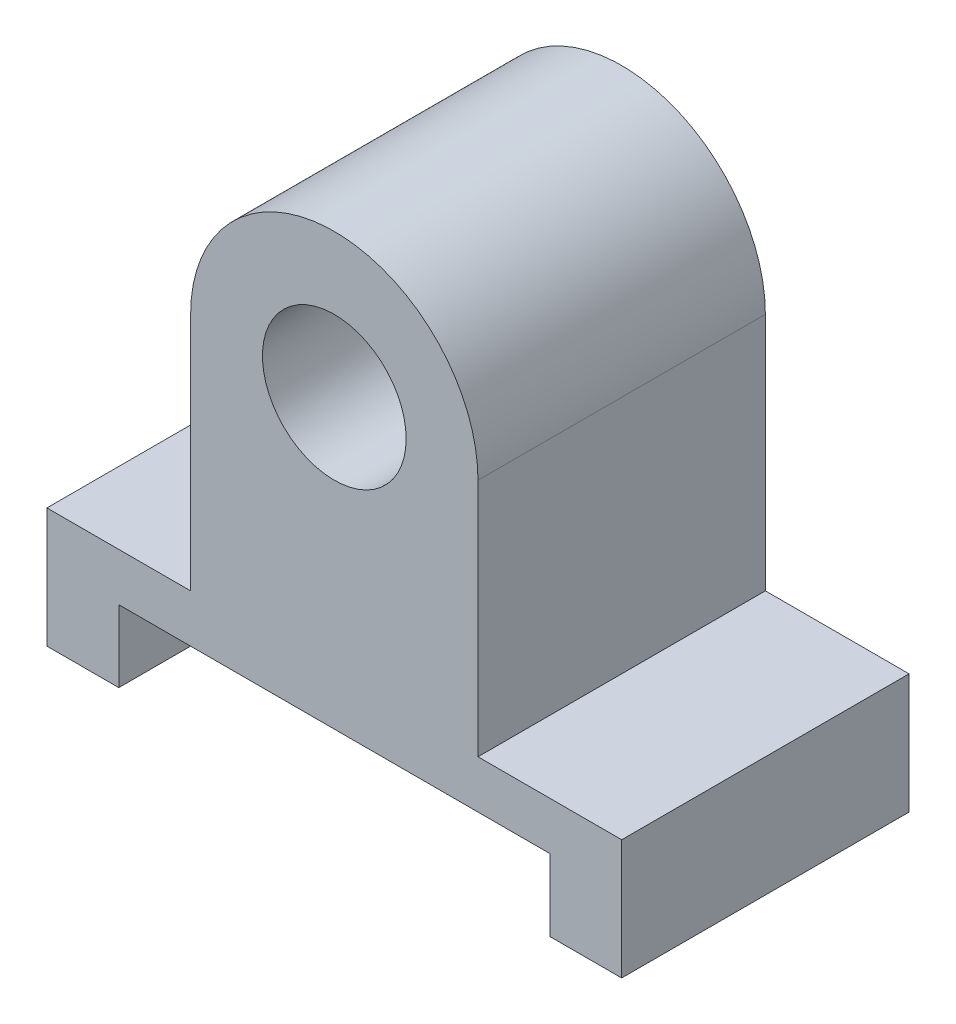
ISO-10303-21;
HEADER;
FILE_DESCRIPTION(('STEP AP214'),'2;1');
FILE_NAME('part.step','',(''),(''),'','','');
FILE_SCHEMA(('AUTOMOTIVE_DESIGN { 1 0 10303 214 1 1 1 1 }'));
ENDSEC;
DATA;
#1=APPLICATION_CONTEXT('core data for automotive mechanical design processes');
#2=APPLICATION_PROTOCOL_DEFINITION('international standard','automotive_design',2000,#1);
#3=PRODUCT_CONTEXT('',#1,'mechanical');
#4=PRODUCT('Part','Part','',(#3));
#5=PRODUCT_RELATED_PRODUCT_CATEGORY('part','',(#4));
#6=PRODUCT_DEFINITION_FORMATION('','',#4);
#7=PRODUCT_DEFINITION_CONTEXT('part definition',#1,'design');
#8=PRODUCT_DEFINITION('design','',#6,#7);
#9=PRODUCT_DEFINITION_SHAPE('','',#8);
#10=(LENGTH_UNIT() NAMED_UNIT(*) SI_UNIT(.MILLI.,.METRE.));
#11=(NAMED_UNIT(*) PLANE_ANGLE_UNIT() SI_UNIT($,.RADIAN.));
#12=(NAMED_UNIT(*) SI_UNIT($,.STERADIAN.) SOLID_ANGLE_UNIT());
#13=UNCERTAINTY_MEASURE_WITH_UNIT(LENGTH_MEASURE(1.E-05),#10,'distance_accuracy_value','');
#14=(GEOMETRIC_REPRESENTATION_CONTEXT(3) GLOBAL_UNCERTAINTY_ASSIGNED_CONTEXT((#13)) GLOBAL_UNIT_ASSIGNED_CONTEXT((#10,
#11,#12)) REPRESENTATION_CONTEXT('',''));
#15=CARTESIAN_POINT('',(0.,0.,0.));
#16=DIRECTION('',(0.,0.,1.));
#17=DIRECTION('',(1.,0.,0.));
#18=AXIS2_PLACEMENT_3D('',#15,#16,#17);
#19=CARTESIAN_POINT('',(47.3975945397528,0.,60.));
#20=DIRECTION('',(1.,0.,0.));
#21=DIRECTION('',(0.,0.,-1.));
#22=AXIS2_PLACEMENT_3D('',#19,#20,#21);
#23=PLANE('',#22);
#24=DIRECTION('',(0.,-1.,0.));
#25=VECTOR('',#24,1.);
#26=CARTESIAN_POINT('',(47.3975945397528,0.,0.));
#27=LINE('',#26,#25);
#28=CARTESIAN_POINT('',(47.3975945397528,38.7118702986329,0.));
#29=VERTEX_POINT('',#28);
#30=CARTESIAN_POINT('',(47.3975945397528,-11.2881297013671,0.));
#31=VERTEX_POINT('',#30);
#32=EDGE_CURVE('E183',#29,#31,#27,.T.);
#33=ORIENTED_EDGE('',*,*,#32,.F.);
#34=DIRECTION('',(0.,0.,-1.));
#35=VECTOR('',#34,1.);
#36=CARTESIAN_POINT('',(47.3975945397528,38.7118702986329,60.));
#37=LINE('',#36,#35);
#38=CARTESIAN_POINT('',(47.3975945397528,38.7118702986329,60.));
#39=VERTEX_POINT('',#38);
#40=EDGE_CURVE('E11',#39,#29,#37,.T.);
#41=ORIENTED_EDGE('',*,*,#40,.F.);
#42=DIRECTION('',(0.,-1.,0.));
#43=VECTOR('',#42,1.);
#44=CARTESIAN_POINT('',(47.3975945397528,0.,60.));
#45=LINE('',#44,#43);
#46=CARTESIAN_POINT('',(47.3975945397528,-11.2881297013671,60.));
#47=VERTEX_POINT('',#46);
#48=EDGE_CURVE('E221',#39,#47,#45,.T.);
#49=ORIENTED_EDGE('',*,*,#48,.T.);
#50=DIRECTION('',(0.,0.,-1.));
#51=VECTOR('',#50,1.);
#52=CARTESIAN_POINT('',(47.3975945397528,-11.2881297013671,60.));
#53=LINE('',#52,#51);
#54=EDGE_CURVE('E53',#47,#31,#53,.T.);
#55=ORIENTED_EDGE('',*,*,#54,.T.);
#56=EDGE_LOOP('',(#33,#41,#49,#55));
#57=FACE_BOUND('',#56,.T.);
#58=ADVANCED_FACE('F36',(#57),#23,.T.);
#59=CARTESIAN_POINT('',(17.3975945397528,38.7118702986329,60.));
#60=DIRECTION('',(0.,0.,-1.));
#61=DIRECTION('',(-1.,0.,0.));
#62=AXIS2_PLACEMENT_3D('',#59,#60,#61);
#63=CYLINDRICAL_SURFACE('',#62,30.);
#64=CARTESIAN_POINT('',(17.3975945397528,38.7118702986329,0.));
#65=DIRECTION('',(0.,0.,1.));
#66=DIRECTION('',(1.,0.,0.));
#67=AXIS2_PLACEMENT_3D('',#64,#65,#66);
#68=CIRCLE('',#67,30.);
#69=CARTESIAN_POINT('',(-12.6024054602472,38.7118702986329,0.));
#70=VERTEX_POINT('',#69);
#71=EDGE_CURVE('E180',#29,#70,#68,.T.);
#72=ORIENTED_EDGE('',*,*,#71,.T.);
#73=DIRECTION('',(0.,0.,-1.));
#74=VECTOR('',#73,1.);
#75=CARTESIAN_POINT('',(-12.6024054602472,38.7118702986329,60.));
#76=LINE('',#75,#74);
#77=CARTESIAN_POINT('',(-12.6024054602472,38.7118702986329,60.));
#78=VERTEX_POINT('',#77);
#79=EDGE_CURVE('E45',#78,#70,#76,.T.);
#80=ORIENTED_EDGE('',*,*,#79,.F.);
#81=CARTESIAN_POINT('',(17.3975945397528,38.7118702986329,60.));
#82=DIRECTION('',(0.,0.,1.));
#83=DIRECTION('',(1.,0.,0.));
#84=AXIS2_PLACEMENT_3D('',#81,#82,#83);
#85=CIRCLE('',#84,30.);
#86=EDGE_CURVE('E220',#39,#78,#85,.T.);
#87=ORIENTED_EDGE('',*,*,#86,.F.);
#88=ORIENTED_EDGE('',*,*,#40,.T.);
#89=EDGE_LOOP('',(#72,#80,#87,#88));
#90=FACE_BOUND('',#89,.T.);
#91=ADVANCED_FACE('F181',(#90),#63,.T.);
#92=CARTESIAN_POINT('',(-12.6024054602472,0.,60.));
#93=DIRECTION('',(1.,0.,0.));
#94=DIRECTION('',(0.,1.,0.));
#95=AXIS2_PLACEMENT_3D('',#92,#93,#94);
#96=PLANE('',#95);
#97=DIRECTION('',(0.,-1.,0.));
#98=VECTOR('',#97,1.);
#99=CARTESIAN_POINT('',(-12.6024054602472,0.,0.));
#100=LINE('',#99,#98);
#101=CARTESIAN_POINT('',(-12.6024054602472,-11.2881297013671,0.));
#102=VERTEX_POINT('',#101);
#103=EDGE_CURVE('E174',#70,#102,#100,.T.);
#104=ORIENTED_EDGE('',*,*,#103,.T.);
#105=DIRECTION('',(0.,0.,-1.));
#106=VECTOR('',#105,1.);
#107=CARTESIAN_POINT('',(-12.6024054602472,-11.2881297013671,60.));
#108=LINE('',#107,#106);
#109=CARTESIAN_POINT('',(-12.6024054602472,-11.2881297013671,60.));
#110=VERTEX_POINT('',#109);
#111=EDGE_CURVE('E166',#110,#102,#108,.T.);
#112=ORIENTED_EDGE('',*,*,#111,.F.);
#113=DIRECTION('',(0.,-1.,0.));
#114=VECTOR('',#113,1.);
#115=CARTESIAN_POINT('',(-12.6024054602472,0.,60.));
#116=LINE('',#115,#114);
#117=EDGE_CURVE('E176',#78,#110,#116,.T.);
#118=ORIENTED_EDGE('',*,*,#117,.F.);
#119=ORIENTED_EDGE('',*,*,#79,.T.);
#120=EDGE_LOOP('',(#104,#112,#118,#119));
#121=FACE_BOUND('',#120,.T.);
#122=ADVANCED_FACE('F172',(#121),#96,.F.);
#123=CARTESIAN_POINT('',(0.,-11.2881297013671,60.));
#124=DIRECTION('',(0.,1.,0.));
#125=DIRECTION('',(0.,0.,1.));
#126=AXIS2_PLACEMENT_3D('',#123,#124,#125);
#127=PLANE('',#126);
#128=DIRECTION('',(1.,0.,0.));
#129=VECTOR('',#128,1.);
#130=CARTESIAN_POINT('',(0.,-11.2881297013671,0.));
#131=LINE('',#130,#129);
#132=CARTESIAN_POINT('',(-42.6024054602472,-11.2881297013671,0.));
#133=VERTEX_POINT('',#132);
#134=EDGE_CURVE('E185',#133,#102,#131,.T.);
#135=ORIENTED_EDGE('',*,*,#134,.F.);
#136=DIRECTION('',(0.,0.,-1.));
#137=VECTOR('',#136,1.);
#138=CARTESIAN_POINT('',(-42.6024054602472,-11.2881297013671,60.));
#139=LINE('',#138,#137);
#140=CARTESIAN_POINT('',(-42.6024054602472,-11.2881297013671,60.));
#141=VERTEX_POINT('',#140);
#142=EDGE_CURVE('E164',#141,#133,#139,.T.);
#143=ORIENTED_EDGE('',*,*,#142,.F.);
#144=DIRECTION('',(1.,0.,0.));
#145=VECTOR('',#144,1.);
#146=CARTESIAN_POINT('',(0.,-11.2881297013671,60.));
#147=LINE('',#146,#145);
#148=EDGE_CURVE('E211',#141,#110,#147,.T.);
#149=ORIENTED_EDGE('',*,*,#148,.T.);
#150=ORIENTED_EDGE('',*,*,#111,.T.);
#151=EDGE_LOOP('',(#135,#143,#149,#150));
#152=FACE_BOUND('',#151,.T.);
#153=ADVANCED_FACE('F234',(#152),#127,.T.);
#154=CARTESIAN_POINT('',(-42.6024054602472,0.,60.));
#155=DIRECTION('',(-1.,0.,0.));
#156=DIRECTION('',(0.,0.,1.));
#157=AXIS2_PLACEMENT_3D('',#154,#155,#156);
#158=PLANE('',#157);
#159=DIRECTION('',(0.,1.,0.));
#160=VECTOR('',#159,1.);
#161=CARTESIAN_POINT('',(-42.6024054602472,0.,0.));
#162=LINE('',#161,#160);
#163=CARTESIAN_POINT('',(-42.6024054602472,-36.2881297013671,0.));
#164=VERTEX_POINT('',#163);
#165=EDGE_CURVE('E192',#164,#133,#162,.T.);
#166=ORIENTED_EDGE('',*,*,#165,.F.);
#167=DIRECTION('',(0.,0.,-1.));
#168=VECTOR('',#167,1.);
#169=CARTESIAN_POINT('',(-42.6024054602472,-36.2881297013671,60.));
#170=LINE('',#169,#168);
#171=CARTESIAN_POINT('',(-42.6024054602472,-36.2881297013671,60.));
#172=VERTEX_POINT('',#171);
#173=EDGE_CURVE('E162',#172,#164,#170,.T.);
#174=ORIENTED_EDGE('',*,*,#173,.F.);
#175=DIRECTION('',(0.,1.,0.));
#176=VECTOR('',#175,1.);
#177=CARTESIAN_POINT('',(-42.6024054602472,0.,60.));
#178=LINE('',#177,#176);
#179=EDGE_CURVE('E215',#172,#141,#178,.T.);
#180=ORIENTED_EDGE('',*,*,#179,.T.);
#181=ORIENTED_EDGE('',*,*,#142,.T.);
#182=EDGE_LOOP('',(#166,#174,#180,#181));
#183=FACE_BOUND('',#182,.T.);
#184=ADVANCED_FACE('F244',(#183),#158,.T.);
#185=CARTESIAN_POINT('',(0.,-36.2881297013671,60.));
#186=DIRECTION('',(0.,-1.,0.));
#187=DIRECTION('',(0.,0.,-1.));
#188=AXIS2_PLACEMENT_3D('',#185,#186,#187);
#189=PLANE('',#188);
#190=DIRECTION('',(-1.,0.,0.));
#191=VECTOR('',#190,1.);
#192=CARTESIAN_POINT('',(0.,-36.2881297013671,0.));
#193=LINE('',#192,#191);
#194=CARTESIAN_POINT('',(-27.6024054602472,-36.2881297013671,0.));
#195=VERTEX_POINT('',#194);
#196=EDGE_CURVE('E196',#195,#164,#193,.T.);
#197=ORIENTED_EDGE('',*,*,#196,.F.);
#198=DIRECTION('',(0.,0.,-1.));
#199=VECTOR('',#198,1.);
#200=CARTESIAN_POINT('',(-27.6024054602472,-36.2881297013671,60.));
#201=LINE('',#200,#199);
#202=CARTESIAN_POINT('',(-27.6024054602472,-36.2881297013671,60.));
#203=VERTEX_POINT('',#202);
#204=EDGE_CURVE('E160',#203,#195,#201,.T.);
#205=ORIENTED_EDGE('',*,*,#204,.F.);
#206=DIRECTION('',(-1.,0.,0.));
#207=VECTOR('',#206,1.);
#208=CARTESIAN_POINT('',(0.,-36.2881297013671,60.));
#209=LINE('',#208,#207);
#210=EDGE_CURVE('E219',#203,#172,#209,.T.);
#211=ORIENTED_EDGE('',*,*,#210,.T.);
#212=ORIENTED_EDGE('',*,*,#173,.T.);
#213=EDGE_LOOP('',(#197,#205,#211,#212));
#214=FACE_BOUND('',#213,.T.);
#215=ADVANCED_FACE('F255',(#214),#189,.T.);
#216=CARTESIAN_POINT('',(-27.6024054602472,0.,60.));
#217=DIRECTION('',(1.,0.,0.));
#218=DIRECTION('',(0.,1.,0.));
#219=AXIS2_PLACEMENT_3D('',#216,#217,#218);
#220=PLANE('',#219);
#221=DIRECTION('',(0.,-1.,0.));
#222=VECTOR('',#221,1.);
#223=CARTESIAN_POINT('',(-27.6024054602472,0.,0.));
#224=LINE('',#223,#222);
#225=CARTESIAN_POINT('',(-27.6024054602472,-21.2881297013671,0.));
#226=VERTEX_POINT('',#225);
#227=EDGE_CURVE('E199',#226,#195,#224,.T.);
#228=ORIENTED_EDGE('',*,*,#227,.F.);
#229=DIRECTION('',(0.,0.,-1.));
#230=VECTOR('',#229,1.);
#231=CARTESIAN_POINT('',(-27.6024054602472,-21.2881297013671,60.));
#232=LINE('',#231,#230);
#233=CARTESIAN_POINT('',(-27.6024054602472,-21.2881297013671,60.));
#234=VERTEX_POINT('',#233);
#235=EDGE_CURVE('E158',#234,#226,#232,.T.);
#236=ORIENTED_EDGE('',*,*,#235,.F.);
#237=DIRECTION('',(0.,-1.,0.));
#238=VECTOR('',#237,1.);
#239=CARTESIAN_POINT('',(-27.6024054602472,0.,60.));
#240=LINE('',#239,#238);
#241=EDGE_CURVE('E315',#234,#203,#240,.T.);
#242=ORIENTED_EDGE('',*,*,#241,.T.);
#243=ORIENTED_EDGE('',*,*,#204,.T.);
#244=EDGE_LOOP('',(#228,#236,#242,#243));
#245=FACE_BOUND('',#244,.T.);
#246=ADVANCED_FACE('F259',(#245),#220,.T.);
#247=CARTESIAN_POINT('',(0.,-21.2881297013671,60.));
#248=DIRECTION('',(0.,1.,0.));
#249=DIRECTION('',(0.,0.,1.));
#250=AXIS2_PLACEMENT_3D('',#247,#248,#249);
#251=PLANE('',#250);
#252=DIRECTION('',(1.,0.,0.));
#253=VECTOR('',#252,1.);
#254=CARTESIAN_POINT('',(0.,-21.2881297013671,0.));
#255=LINE('',#254,#253);
#256=CARTESIAN_POINT('',(62.3975945397528,-21.2881297013671,0.));
#257=VERTEX_POINT('',#256);
#258=EDGE_CURVE('E202',#226,#257,#255,.T.);
#259=ORIENTED_EDGE('',*,*,#258,.T.);
#260=DIRECTION('',(0.,0.,-1.));
#261=VECTOR('',#260,1.);
#262=CARTESIAN_POINT('',(62.3975945397528,-21.2881297013671,60.));
#263=LINE('',#262,#261);
#264=CARTESIAN_POINT('',(62.3975945397528,-21.2881297013671,60.));
#265=VERTEX_POINT('',#264);
#266=EDGE_CURVE('E151',#265,#257,#263,.T.);
#267=ORIENTED_EDGE('',*,*,#266,.F.);
#268=DIRECTION('',(1.,0.,0.));
#269=VECTOR('',#268,1.);
#270=CARTESIAN_POINT('',(0.,-21.2881297013671,60.));
#271=LINE('',#270,#269);
#272=EDGE_CURVE('E313',#234,#265,#271,.T.);
#273=ORIENTED_EDGE('',*,*,#272,.F.);
#274=ORIENTED_EDGE('',*,*,#235,.T.);
#275=EDGE_LOOP('',(#259,#267,#273,#274));
#276=FACE_BOUND('',#275,.T.);
#277=ADVANCED_FACE('F263',(#276),#251,.F.);
#278=CARTESIAN_POINT('',(62.3975945397528,0.,60.));
#279=DIRECTION('',(1.,0.,0.));
#280=DIRECTION('',(0.,0.,-1.));
#281=AXIS2_PLACEMENT_3D('',#278,#279,#280);
#282=PLANE('',#281);
#283=DIRECTION('',(0.,-1.,0.));
#284=VECTOR('',#283,1.);
#285=CARTESIAN_POINT('',(62.3975945397528,0.,0.));
#286=LINE('',#285,#284);
#287=CARTESIAN_POINT('',(62.3975945397528,-36.2881297013671,0.));
#288=VERTEX_POINT('',#287);
#289=EDGE_CURVE('E205',#257,#288,#286,.T.);
#290=ORIENTED_EDGE('',*,*,#289,.T.);
#291=DIRECTION('',(0.,0.,-1.));
#292=VECTOR('',#291,1.);
#293=CARTESIAN_POINT('',(62.3975945397528,-36.2881297013671,60.));
#294=LINE('',#293,#292);
#295=CARTESIAN_POINT('',(62.3975945397528,-36.2881297013671,60.));
#296=VERTEX_POINT('',#295);
#297=EDGE_CURVE('E149',#296,#288,#294,.T.);
#298=ORIENTED_EDGE('',*,*,#297,.F.);
#299=DIRECTION('',(0.,-1.,0.));
#300=VECTOR('',#299,1.);
#301=CARTESIAN_POINT('',(62.3975945397528,0.,60.));
#302=LINE('',#301,#300);
#303=EDGE_CURVE('E142',#265,#296,#302,.T.);
#304=ORIENTED_EDGE('',*,*,#303,.F.);
#305=ORIENTED_EDGE('',*,*,#266,.T.);
#306=EDGE_LOOP('',(#290,#298,#304,#305));
#307=FACE_BOUND('',#306,.T.);
#308=ADVANCED_FACE('F267',(#307),#282,.F.);
#309=CARTESIAN_POINT('',(0.,-36.2881297013671,60.));
#310=DIRECTION('',(0.,1.,0.));
#311=DIRECTION('',(0.,0.,1.));
#312=AXIS2_PLACEMENT_3D('',#309,#310,#311);
#313=PLANE('',#312);
#314=DIRECTION('',(1.,0.,0.));
#315=VECTOR('',#314,1.);
#316=CARTESIAN_POINT('',(0.,-36.2881297013671,0.));
#317=LINE('',#316,#315);
#318=CARTESIAN_POINT('',(77.3975945397528,-36.2881297013671,0.));
#319=VERTEX_POINT('',#318);
#320=EDGE_CURVE('E148',#288,#319,#317,.T.);
#321=ORIENTED_EDGE('',*,*,#320,.T.);
#322=DIRECTION('',(0.,0.,-1.));
#323=VECTOR('',#322,1.);
#324=CARTESIAN_POINT('',(77.3975945397528,-36.2881297013671,60.));
#325=LINE('',#324,#323);
#326=CARTESIAN_POINT('',(77.3975945397528,-36.2881297013671,60.));
#327=VERTEX_POINT('',#326);
#328=EDGE_CURVE('E131',#327,#319,#325,.T.);
#329=ORIENTED_EDGE('',*,*,#328,.F.);
#330=DIRECTION('',(1.,0.,0.));
#331=VECTOR('',#330,1.);
#332=CARTESIAN_POINT('',(0.,-36.2881297013671,60.));
#333=LINE('',#332,#331);
#334=EDGE_CURVE('E136',#296,#327,#333,.T.);
#335=ORIENTED_EDGE('',*,*,#334,.F.);
#336=ORIENTED_EDGE('',*,*,#297,.T.);
#337=EDGE_LOOP('',(#321,#329,#335,#336));
#338=FACE_BOUND('',#337,.T.);
#339=ADVANCED_FACE('F147',(#338),#313,.F.);
#340=CARTESIAN_POINT('',(77.3975945397528,0.,60.));
#341=DIRECTION('',(-1.,0.,0.));
#342=DIRECTION('',(0.,0.,1.));
#343=AXIS2_PLACEMENT_3D('',#340,#341,#342);
#344=PLANE('',#343);
#345=DIRECTION('',(0.,1.,0.));
#346=VECTOR('',#345,1.);
#347=CARTESIAN_POINT('',(77.3975945397528,0.,0.));
#348=LINE('',#347,#346);
#349=CARTESIAN_POINT('',(77.3975945397528,-11.2881297013671,0.));
#350=VERTEX_POINT('',#349);
#351=EDGE_CURVE('E209',#319,#350,#348,.T.);
#352=ORIENTED_EDGE('',*,*,#351,.T.);
#353=DIRECTION('',(0.,0.,-1.));
#354=VECTOR('',#353,1.);
#355=CARTESIAN_POINT('',(77.3975945397528,-11.2881297013671,60.));
#356=LINE('',#355,#354);
#357=CARTESIAN_POINT('',(77.3975945397528,-11.2881297013671,60.));
#358=VERTEX_POINT('',#357);
#359=EDGE_CURVE('E91',#358,#350,#356,.T.);
#360=ORIENTED_EDGE('',*,*,#359,.F.);
#361=DIRECTION('',(0.,1.,0.));
#362=VECTOR('',#361,1.);
#363=CARTESIAN_POINT('',(77.3975945397528,0.,60.));
#364=LINE('',#363,#362);
#365=EDGE_CURVE('E127',#327,#358,#364,.T.);
#366=ORIENTED_EDGE('',*,*,#365,.F.);
#367=ORIENTED_EDGE('',*,*,#328,.T.);
#368=EDGE_LOOP('',(#352,#360,#366,#367));
#369=FACE_BOUND('',#368,.T.);
#370=ADVANCED_FACE('F129',(#369),#344,.F.);
#371=CARTESIAN_POINT('',(17.3975945397528,38.7118702986329,60.));
#372=DIRECTION('',(0.,0.,-1.));
#373=DIRECTION('',(-1.,0.,0.));
#374=AXIS2_PLACEMENT_3D('',#371,#372,#373);
#375=CYLINDRICAL_SURFACE('',#374,15.);
#376=CARTESIAN_POINT('',(17.3975945397528,38.7118702986329,60.));
#377=DIRECTION('',(0.,0.,1.));
#378=DIRECTION('',(1.,0.,0.));
#379=AXIS2_PLACEMENT_3D('',#376,#377,#378);
#380=CIRCLE('',#379,15.);
#381=CARTESIAN_POINT('',(32.3975945397528,38.7118702986329,60.));
#382=VERTEX_POINT('',#381);
#383=EDGE_CURVE('E225',#382,#382,#380,.T.);
#384=ORIENTED_EDGE('',*,*,#383,.T.);
#385=EDGE_LOOP('',(#384));
#386=FACE_BOUND('',#385,.T.);
#387=CARTESIAN_POINT('',(17.3975945397528,38.7118702986329,0.));
#388=DIRECTION('',(0.,0.,1.));
#389=DIRECTION('',(1.,0.,0.));
#390=AXIS2_PLACEMENT_3D('',#387,#388,#389);
#391=CIRCLE('',#390,15.);
#392=CARTESIAN_POINT('',(32.3975945397528,38.7118702986329,0.));
#393=VERTEX_POINT('',#392);
#394=EDGE_CURVE('E187',#393,#393,#391,.T.);
#395=ORIENTED_EDGE('',*,*,#394,.F.);
#396=EDGE_LOOP('',(#395));
#397=FACE_BOUND('',#396,.T.);
#398=ADVANCED_FACE('F38',(#386,#397),#375,.F.);
#399=EDGE_CURVE('E193',#31,#350,#131,.T.);
#400=ORIENTED_EDGE('',*,*,#399,.F.);
#401=ORIENTED_EDGE('',*,*,#54,.F.);
#402=EDGE_CURVE('E135',#47,#358,#147,.T.);
#403=ORIENTED_EDGE('',*,*,#402,.T.);
#404=ORIENTED_EDGE('',*,*,#359,.T.);
#405=EDGE_LOOP('',(#400,#401,#403,#404));
#406=FACE_BOUND('',#405,.T.);
#407=ADVANCED_FACE('F231',(#406),#127,.T.);
#408=CARTESIAN_POINT('',(0.,0.,60.));
#409=DIRECTION('',(0.,0.,1.));
#410=DIRECTION('',(1.,0.,0.));
#411=AXIS2_PLACEMENT_3D('',#408,#409,#410);
#412=PLANE('',#411);
#413=ORIENTED_EDGE('',*,*,#383,.F.);
#414=EDGE_LOOP('',(#413));
#415=FACE_BOUND('',#414,.T.);
#416=ORIENTED_EDGE('',*,*,#48,.F.);
#417=ORIENTED_EDGE('',*,*,#86,.T.);
#418=ORIENTED_EDGE('',*,*,#117,.T.);
#419=ORIENTED_EDGE('',*,*,#148,.F.);
#420=ORIENTED_EDGE('',*,*,#179,.F.);
#421=ORIENTED_EDGE('',*,*,#210,.F.);
#422=ORIENTED_EDGE('',*,*,#241,.F.);
#423=ORIENTED_EDGE('',*,*,#272,.T.);
#424=ORIENTED_EDGE('',*,*,#303,.T.);
#425=ORIENTED_EDGE('',*,*,#334,.T.);
#426=ORIENTED_EDGE('',*,*,#365,.T.);
#427=ORIENTED_EDGE('',*,*,#402,.F.);
#428=EDGE_LOOP('',(#416,#417,#418,#419,#420,#421,#422,#423,#424,#425,#426,#427));
#429=FACE_BOUND('',#428,.T.);
#430=ADVANCED_FACE('F140',(#415,#429),#412,.T.);
#431=CARTESIAN_POINT('',(0.,0.,0.));
#432=DIRECTION('',(0.,0.,1.));
#433=DIRECTION('',(1.,0.,0.));
#434=AXIS2_PLACEMENT_3D('',#431,#432,#433);
#435=PLANE('',#434);
#436=ORIENTED_EDGE('',*,*,#394,.T.);
#437=EDGE_LOOP('',(#436));
#438=FACE_BOUND('',#437,.T.);
#439=ORIENTED_EDGE('',*,*,#32,.T.);
#440=ORIENTED_EDGE('',*,*,#399,.T.);
#441=ORIENTED_EDGE('',*,*,#351,.F.);
#442=ORIENTED_EDGE('',*,*,#320,.F.);
#443=ORIENTED_EDGE('',*,*,#289,.F.);
#444=ORIENTED_EDGE('',*,*,#258,.F.);
#445=ORIENTED_EDGE('',*,*,#227,.T.);
#446=ORIENTED_EDGE('',*,*,#196,.T.);
#447=ORIENTED_EDGE('',*,*,#165,.T.);
#448=ORIENTED_EDGE('',*,*,#134,.T.);
#449=ORIENTED_EDGE('',*,*,#103,.F.);
#450=ORIENTED_EDGE('',*,*,#71,.F.);
#451=EDGE_LOOP('',(#439,#440,#441,#442,#443,#444,#445,#446,#447,#448,#449,#450));
#452=FACE_BOUND('',#451,.T.);
#453=ADVANCED_FACE('F230',(#438,#452),#435,.F.);
#454=CLOSED_SHELL('',(#58,#91,#122,#153,#184,#215,#246,#277,#308,#339,#370,#398,#407,#430,#453));
#455=MANIFOLD_SOLID_BREP('B2',#454);
#456=ADVANCED_BREP_SHAPE_REPRESENTATION('',(#18,#455),#14);
#457=SHAPE_DEFINITION_REPRESENTATION(#9,#456);
ENDSEC;
END-ISO-10303-21;
